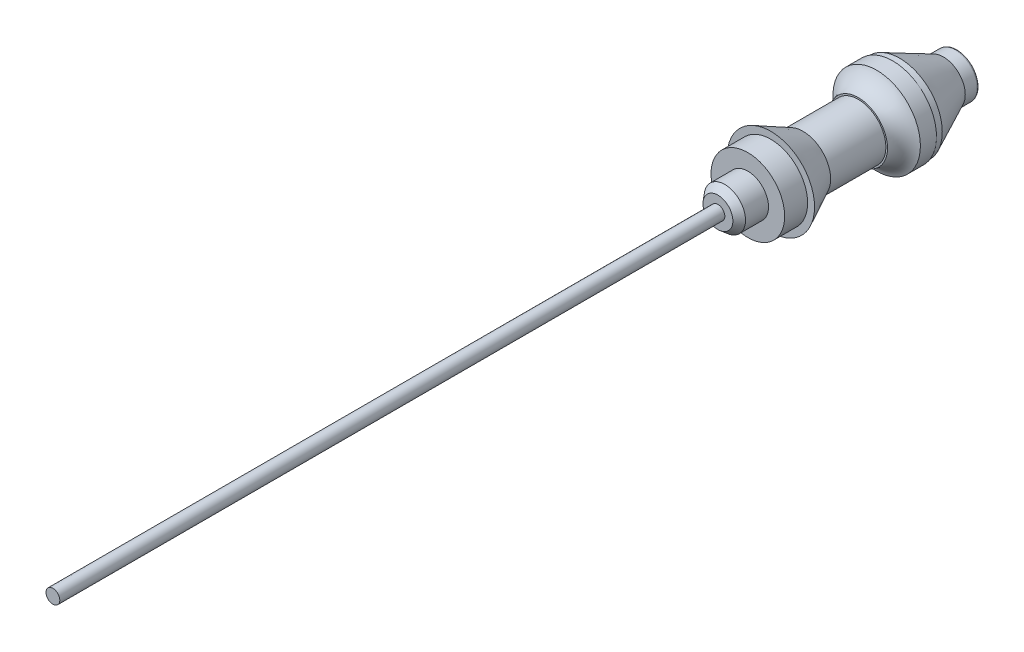
ISO-10303-21;
HEADER;
FILE_DESCRIPTION(('STEP AP214'),'2;1');
FILE_NAME('part.step','',(''),(''),'','','');
FILE_SCHEMA(('AUTOMOTIVE_DESIGN { 1 0 10303 214 1 1 1 1 }'));
ENDSEC;
DATA;
#1=APPLICATION_CONTEXT('core data for automotive mechanical design processes');
#2=APPLICATION_PROTOCOL_DEFINITION('international standard','automotive_design',2000,#1);
#3=PRODUCT_CONTEXT('',#1,'mechanical');
#4=PRODUCT('Part','Part','',(#3));
#5=PRODUCT_RELATED_PRODUCT_CATEGORY('part','',(#4));
#6=PRODUCT_DEFINITION_FORMATION('','',#4);
#7=PRODUCT_DEFINITION_CONTEXT('part definition',#1,'design');
#8=PRODUCT_DEFINITION('design','',#6,#7);
#9=PRODUCT_DEFINITION_SHAPE('','',#8);
#10=(LENGTH_UNIT() NAMED_UNIT(*) SI_UNIT(.MILLI.,.METRE.));
#11=(NAMED_UNIT(*) PLANE_ANGLE_UNIT() SI_UNIT($,.RADIAN.));
#12=(NAMED_UNIT(*) SI_UNIT($,.STERADIAN.) SOLID_ANGLE_UNIT());
#13=UNCERTAINTY_MEASURE_WITH_UNIT(LENGTH_MEASURE(1.E-05),#10,'distance_accuracy_value','');
#14=(GEOMETRIC_REPRESENTATION_CONTEXT(3) GLOBAL_UNCERTAINTY_ASSIGNED_CONTEXT((#13)) GLOBAL_UNIT_ASSIGNED_CONTEXT((#10,
#11,#12)) REPRESENTATION_CONTEXT('',''));
#15=CARTESIAN_POINT('',(0.,0.,0.));
#16=DIRECTION('',(0.,0.,1.));
#17=DIRECTION('',(1.,0.,0.));
#18=AXIS2_PLACEMENT_3D('',#15,#16,#17);
#19=CARTESIAN_POINT('',(0.,8.7,-393.));
#20=DIRECTION('',(0.,0.,1.));
#21=DIRECTION('',(1.,0.,0.));
#22=AXIS2_PLACEMENT_3D('',#19,#20,#21);
#23=PLANE('',#22);
#24=CARTESIAN_POINT('',(0.,0.,-393.));
#25=DIRECTION('',(0.,0.,1.));
#26=DIRECTION('',(1.,0.,0.));
#27=AXIS2_PLACEMENT_3D('',#24,#25,#26);
#28=CIRCLE('',#27,8.7);
#29=CARTESIAN_POINT('',(8.7,0.,-393.));
#30=VERTEX_POINT('',#29);
#31=EDGE_CURVE('E10',#30,#30,#28,.T.);
#32=ORIENTED_EDGE('',*,*,#31,.F.);
#33=EDGE_LOOP('',(#32));
#34=FACE_BOUND('',#33,.T.);
#35=ADVANCED_FACE('F33',(#34),#23,.F.);
#36=CARTESIAN_POINT('',(0.,0.,-392.2));
#37=DIRECTION('',(0.,0.,1.));
#38=DIRECTION('',(1.,0.,0.));
#39=AXIS2_PLACEMENT_3D('',#36,#37,#38);
#40=TOROIDAL_SURFACE('',#39,8.7,0.800000000000011);
#41=CARTESIAN_POINT('',(0.,0.,-392.2));
#42=DIRECTION('',(0.,0.,1.));
#43=DIRECTION('',(1.,0.,0.));
#44=AXIS2_PLACEMENT_3D('',#41,#42,#43);
#45=CIRCLE('',#44,9.5);
#46=CARTESIAN_POINT('',(9.5,0.,-392.2));
#47=VERTEX_POINT('',#46);
#48=EDGE_CURVE('E39',#47,#47,#45,.T.);
#49=ORIENTED_EDGE('',*,*,#48,.F.);
#50=EDGE_LOOP('',(#49));
#51=FACE_BOUND('',#50,.T.);
#52=ORIENTED_EDGE('',*,*,#31,.T.);
#53=EDGE_LOOP('',(#52));
#54=FACE_BOUND('',#53,.T.);
#55=ADVANCED_FACE('F189',(#51,#54),#40,.T.);
#56=CARTESIAN_POINT('',(0.,0.,0.));
#57=DIRECTION('',(0.,0.,1.));
#58=DIRECTION('',(1.,0.,0.));
#59=AXIS2_PLACEMENT_3D('',#56,#57,#58);
#60=CYLINDRICAL_SURFACE('',#59,9.5);
#61=CARTESIAN_POINT('',(0.,0.,-387.));
#62=DIRECTION('',(0.,0.,1.));
#63=DIRECTION('',(1.,0.,0.));
#64=AXIS2_PLACEMENT_3D('',#61,#62,#63);
#65=CIRCLE('',#64,9.5);
#66=CARTESIAN_POINT('',(9.5,0.,-387.));
#67=VERTEX_POINT('',#66);
#68=EDGE_CURVE('E43',#67,#67,#65,.T.);
#69=ORIENTED_EDGE('',*,*,#68,.F.);
#70=EDGE_LOOP('',(#69));
#71=FACE_BOUND('',#70,.T.);
#72=ORIENTED_EDGE('',*,*,#48,.T.);
#73=EDGE_LOOP('',(#72));
#74=FACE_BOUND('',#73,.T.);
#75=ADVANCED_FACE('F184',(#71,#74),#60,.T.);
#76=CARTESIAN_POINT('',(0.,0.,-387.));
#77=DIRECTION('',(0.,0.,1.));
#78=DIRECTION('',(1.,0.,0.));
#79=AXIS2_PLACEMENT_3D('',#76,#77,#78);
#80=CONICAL_SURFACE('',#79,9.5,0.442374222976745);
#81=CARTESIAN_POINT('',(0.,0.,-368.));
#82=DIRECTION('',(0.,0.,1.));
#83=DIRECTION('',(1.,0.,0.));
#84=AXIS2_PLACEMENT_3D('',#81,#82,#83);
#85=CIRCLE('',#84,18.5);
#86=CARTESIAN_POINT('',(18.5,0.,-368.));
#87=VERTEX_POINT('',#86);
#88=EDGE_CURVE('E47',#87,#87,#85,.T.);
#89=ORIENTED_EDGE('',*,*,#88,.F.);
#90=EDGE_LOOP('',(#89));
#91=FACE_BOUND('',#90,.T.);
#92=ORIENTED_EDGE('',*,*,#68,.T.);
#93=EDGE_LOOP('',(#92));
#94=FACE_BOUND('',#93,.T.);
#95=ADVANCED_FACE('F178',(#91,#94),#80,.T.);
#96=CARTESIAN_POINT('',(0.,0.,0.));
#97=DIRECTION('',(0.,0.,1.));
#98=DIRECTION('',(1.,0.,0.));
#99=AXIS2_PLACEMENT_3D('',#96,#97,#98);
#100=CYLINDRICAL_SURFACE('',#99,18.5);
#101=CARTESIAN_POINT('',(0.,0.,-365.));
#102=DIRECTION('',(0.,0.,1.));
#103=DIRECTION('',(1.,0.,0.));
#104=AXIS2_PLACEMENT_3D('',#101,#102,#103);
#105=CIRCLE('',#104,18.5);
#106=CARTESIAN_POINT('',(18.5,0.,-365.));
#107=VERTEX_POINT('',#106);
#108=EDGE_CURVE('E52',#107,#107,#105,.T.);
#109=ORIENTED_EDGE('',*,*,#108,.F.);
#110=EDGE_LOOP('',(#109));
#111=FACE_BOUND('',#110,.T.);
#112=ORIENTED_EDGE('',*,*,#88,.T.);
#113=EDGE_LOOP('',(#112));
#114=FACE_BOUND('',#113,.T.);
#115=ADVANCED_FACE('F172',(#111,#114),#100,.T.);
#116=CARTESIAN_POINT('',(0.,19.,-365.));
#117=DIRECTION('',(0.,0.,1.));
#118=DIRECTION('',(1.,0.,0.));
#119=AXIS2_PLACEMENT_3D('',#116,#117,#118);
#120=PLANE('',#119);
#121=CARTESIAN_POINT('',(0.,0.,-365.));
#122=DIRECTION('',(0.,0.,1.));
#123=DIRECTION('',(1.,0.,0.));
#124=AXIS2_PLACEMENT_3D('',#121,#122,#123);
#125=CIRCLE('',#124,19.);
#126=CARTESIAN_POINT('',(19.,0.,-365.));
#127=VERTEX_POINT('',#126);
#128=EDGE_CURVE('E55',#127,#127,#125,.T.);
#129=ORIENTED_EDGE('',*,*,#128,.F.);
#130=EDGE_LOOP('',(#129));
#131=FACE_BOUND('',#130,.T.);
#132=ORIENTED_EDGE('',*,*,#108,.T.);
#133=EDGE_LOOP('',(#132));
#134=FACE_BOUND('',#133,.T.);
#135=ADVANCED_FACE('F166',(#131,#134),#120,.F.);
#136=CARTESIAN_POINT('',(0.,0.,0.));
#137=DIRECTION('',(0.,0.,1.));
#138=DIRECTION('',(1.,0.,0.));
#139=AXIS2_PLACEMENT_3D('',#136,#137,#138);
#140=CYLINDRICAL_SURFACE('',#139,19.);
#141=CARTESIAN_POINT('',(0.,0.,-357.999073931162));
#142=DIRECTION('',(0.,0.,1.));
#143=DIRECTION('',(1.,0.,0.));
#144=AXIS2_PLACEMENT_3D('',#141,#142,#143);
#145=CIRCLE('',#144,19.);
#146=CARTESIAN_POINT('',(19.,0.,-357.999073931162));
#147=VERTEX_POINT('',#146);
#148=EDGE_CURVE('E58',#147,#147,#145,.T.);
#149=ORIENTED_EDGE('',*,*,#148,.F.);
#150=EDGE_LOOP('',(#149));
#151=FACE_BOUND('',#150,.T.);
#152=ORIENTED_EDGE('',*,*,#128,.T.);
#153=EDGE_LOOP('',(#152));
#154=FACE_BOUND('',#153,.T.);
#155=ADVANCED_FACE('F160',(#151,#154),#140,.T.);
#156=CARTESIAN_POINT('',(0.,0.,-348.674127160922));
#157=DIRECTION('',(0.,0.,1.));
#158=DIRECTION('',(1.,0.,0.));
#159=AXIS2_PLACEMENT_3D('',#156,#157,#158);
#160=TOROIDAL_SURFACE('',#159,22.6118371685591,10.);
#161=CARTESIAN_POINT('',(0.,0.,-349.999073931162));
#162=DIRECTION('',(0.,0.,1.));
#163=DIRECTION('',(1.,0.,0.));
#164=AXIS2_PLACEMENT_3D('',#161,#162,#163);
#165=CIRCLE('',#164,12.7);
#166=CARTESIAN_POINT('',(12.7,0.,-349.999073931162));
#167=VERTEX_POINT('',#166);
#168=EDGE_CURVE('E61',#167,#167,#165,.T.);
#169=ORIENTED_EDGE('',*,*,#168,.F.);
#170=EDGE_LOOP('',(#169));
#171=FACE_BOUND('',#170,.T.);
#172=ORIENTED_EDGE('',*,*,#148,.T.);
#173=EDGE_LOOP('',(#172));
#174=FACE_BOUND('',#173,.T.);
#175=ADVANCED_FACE('F154',(#171,#174),#160,.F.);
#176=CARTESIAN_POINT('',(0.,12.,-349.999073931162));
#177=DIRECTION('',(0.,0.,-1.));
#178=DIRECTION('',(-1.,0.,0.));
#179=AXIS2_PLACEMENT_3D('',#176,#177,#178);
#180=PLANE('',#179);
#181=CARTESIAN_POINT('',(0.,0.,-349.999073931162));
#182=DIRECTION('',(0.,0.,1.));
#183=DIRECTION('',(1.,0.,0.));
#184=AXIS2_PLACEMENT_3D('',#181,#182,#183);
#185=CIRCLE('',#184,12.);
#186=CARTESIAN_POINT('',(12.,0.,-349.999073931162));
#187=VERTEX_POINT('',#186);
#188=EDGE_CURVE('E64',#187,#187,#185,.T.);
#189=ORIENTED_EDGE('',*,*,#188,.F.);
#190=EDGE_LOOP('',(#189));
#191=FACE_BOUND('',#190,.T.);
#192=ORIENTED_EDGE('',*,*,#168,.T.);
#193=EDGE_LOOP('',(#192));
#194=FACE_BOUND('',#193,.T.);
#195=ADVANCED_FACE('F148',(#191,#194),#180,.F.);
#196=CARTESIAN_POINT('',(0.,0.,0.));
#197=DIRECTION('',(0.,0.,1.));
#198=DIRECTION('',(1.,0.,0.));
#199=AXIS2_PLACEMENT_3D('',#196,#197,#198);
#200=CYLINDRICAL_SURFACE('',#199,12.);
#201=CARTESIAN_POINT('',(0.,0.,-325.999073931162));
#202=DIRECTION('',(0.,0.,1.));
#203=DIRECTION('',(1.,0.,0.));
#204=AXIS2_PLACEMENT_3D('',#201,#202,#203);
#205=CIRCLE('',#204,12.);
#206=CARTESIAN_POINT('',(12.,0.,-325.999073931162));
#207=VERTEX_POINT('',#206);
#208=EDGE_CURVE('E67',#207,#207,#205,.T.);
#209=ORIENTED_EDGE('',*,*,#208,.F.);
#210=EDGE_LOOP('',(#209));
#211=FACE_BOUND('',#210,.T.);
#212=ORIENTED_EDGE('',*,*,#188,.T.);
#213=EDGE_LOOP('',(#212));
#214=FACE_BOUND('',#213,.T.);
#215=ADVANCED_FACE('F142',(#211,#214),#200,.T.);
#216=CARTESIAN_POINT('',(0.,0.,-325.999073931162));
#217=DIRECTION('',(0.,0.,1.));
#218=DIRECTION('',(1.,0.,0.));
#219=AXIS2_PLACEMENT_3D('',#216,#217,#218);
#220=CONICAL_SURFACE('',#219,12.,0.463647609000806);
#221=CARTESIAN_POINT('',(0.,0.,-311.999073931162));
#222=DIRECTION('',(0.,0.,1.));
#223=DIRECTION('',(1.,0.,0.));
#224=AXIS2_PLACEMENT_3D('',#221,#222,#223);
#225=CIRCLE('',#224,19.);
#226=CARTESIAN_POINT('',(19.,0.,-311.999073931162));
#227=VERTEX_POINT('',#226);
#228=EDGE_CURVE('E70',#227,#227,#225,.T.);
#229=ORIENTED_EDGE('',*,*,#228,.F.);
#230=EDGE_LOOP('',(#229));
#231=FACE_BOUND('',#230,.T.);
#232=ORIENTED_EDGE('',*,*,#208,.T.);
#233=EDGE_LOOP('',(#232));
#234=FACE_BOUND('',#233,.T.);
#235=ADVANCED_FACE('F136',(#231,#234),#220,.T.);
#236=CARTESIAN_POINT('',(0.,16.,-311.999073931162));
#237=DIRECTION('',(0.,0.,-1.));
#238=DIRECTION('',(-1.,0.,0.));
#239=AXIS2_PLACEMENT_3D('',#236,#237,#238);
#240=PLANE('',#239);
#241=CARTESIAN_POINT('',(0.,0.,-311.999073931162));
#242=DIRECTION('',(0.,0.,1.));
#243=DIRECTION('',(1.,0.,0.));
#244=AXIS2_PLACEMENT_3D('',#241,#242,#243);
#245=CIRCLE('',#244,16.);
#246=CARTESIAN_POINT('',(16.,0.,-311.999073931162));
#247=VERTEX_POINT('',#246);
#248=EDGE_CURVE('E73',#247,#247,#245,.T.);
#249=ORIENTED_EDGE('',*,*,#248,.F.);
#250=EDGE_LOOP('',(#249));
#251=FACE_BOUND('',#250,.T.);
#252=ORIENTED_EDGE('',*,*,#228,.T.);
#253=EDGE_LOOP('',(#252));
#254=FACE_BOUND('',#253,.T.);
#255=ADVANCED_FACE('F130',(#251,#254),#240,.F.);
#256=CARTESIAN_POINT('',(0.,0.,0.));
#257=DIRECTION('',(0.,0.,1.));
#258=DIRECTION('',(1.,0.,0.));
#259=AXIS2_PLACEMENT_3D('',#256,#257,#258);
#260=CYLINDRICAL_SURFACE('',#259,16.);
#261=CARTESIAN_POINT('',(0.,0.,-301.999073931162));
#262=DIRECTION('',(0.,0.,1.));
#263=DIRECTION('',(1.,0.,0.));
#264=AXIS2_PLACEMENT_3D('',#261,#262,#263);
#265=CIRCLE('',#264,16.);
#266=CARTESIAN_POINT('',(16.,0.,-301.999073931162));
#267=VERTEX_POINT('',#266);
#268=EDGE_CURVE('E76',#267,#267,#265,.T.);
#269=ORIENTED_EDGE('',*,*,#268,.F.);
#270=EDGE_LOOP('',(#269));
#271=FACE_BOUND('',#270,.T.);
#272=ORIENTED_EDGE('',*,*,#248,.T.);
#273=EDGE_LOOP('',(#272));
#274=FACE_BOUND('',#273,.T.);
#275=ADVANCED_FACE('F124',(#271,#274),#260,.T.);
#276=CARTESIAN_POINT('',(0.,9.,-301.999073931162));
#277=DIRECTION('',(0.,0.,-1.));
#278=DIRECTION('',(-1.,0.,0.));
#279=AXIS2_PLACEMENT_3D('',#276,#277,#278);
#280=PLANE('',#279);
#281=CARTESIAN_POINT('',(0.,0.,-301.999073931162));
#282=DIRECTION('',(0.,0.,1.));
#283=DIRECTION('',(1.,0.,0.));
#284=AXIS2_PLACEMENT_3D('',#281,#282,#283);
#285=CIRCLE('',#284,9.);
#286=CARTESIAN_POINT('',(9.,0.,-301.999073931162));
#287=VERTEX_POINT('',#286);
#288=EDGE_CURVE('E79',#287,#287,#285,.T.);
#289=ORIENTED_EDGE('',*,*,#288,.F.);
#290=EDGE_LOOP('',(#289));
#291=FACE_BOUND('',#290,.T.);
#292=ORIENTED_EDGE('',*,*,#268,.T.);
#293=EDGE_LOOP('',(#292));
#294=FACE_BOUND('',#293,.T.);
#295=ADVANCED_FACE('F118',(#291,#294),#280,.F.);
#296=CARTESIAN_POINT('',(0.,0.,0.));
#297=DIRECTION('',(0.,0.,1.));
#298=DIRECTION('',(1.,0.,0.));
#299=AXIS2_PLACEMENT_3D('',#296,#297,#298);
#300=CYLINDRICAL_SURFACE('',#299,9.);
#301=CARTESIAN_POINT('',(0.,0.,-291.999073931162));
#302=DIRECTION('',(0.,0.,1.));
#303=DIRECTION('',(1.,0.,0.));
#304=AXIS2_PLACEMENT_3D('',#301,#302,#303);
#305=CIRCLE('',#304,9.);
#306=CARTESIAN_POINT('',(9.,0.,-291.999073931162));
#307=VERTEX_POINT('',#306);
#308=EDGE_CURVE('E82',#307,#307,#305,.T.);
#309=ORIENTED_EDGE('',*,*,#308,.F.);
#310=EDGE_LOOP('',(#309));
#311=FACE_BOUND('',#310,.T.);
#312=ORIENTED_EDGE('',*,*,#288,.T.);
#313=EDGE_LOOP('',(#312));
#314=FACE_BOUND('',#313,.T.);
#315=ADVANCED_FACE('F112',(#311,#314),#300,.T.);
#316=CARTESIAN_POINT('',(0.,0.,-291.999073931162));
#317=DIRECTION('',(0.,0.,-1.));
#318=DIRECTION('',(-1.,0.,0.));
#319=AXIS2_PLACEMENT_3D('',#316,#317,#318);
#320=CONICAL_SURFACE('',#319,9.,0.69489011842134);
#321=CARTESIAN_POINT('',(0.,0.,-289.));
#322=DIRECTION('',(0.,0.,1.));
#323=DIRECTION('',(1.,0.,0.));
#324=AXIS2_PLACEMENT_3D('',#321,#322,#323);
#325=CIRCLE('',#324,6.5);
#326=CARTESIAN_POINT('',(6.5,0.,-289.));
#327=VERTEX_POINT('',#326);
#328=EDGE_CURVE('E85',#327,#327,#325,.T.);
#329=ORIENTED_EDGE('',*,*,#328,.F.);
#330=EDGE_LOOP('',(#329));
#331=FACE_BOUND('',#330,.T.);
#332=ORIENTED_EDGE('',*,*,#308,.T.);
#333=EDGE_LOOP('',(#332));
#334=FACE_BOUND('',#333,.T.);
#335=ADVANCED_FACE('F106',(#331,#334),#320,.T.);
#336=CARTESIAN_POINT('',(0.,3.,-289.));
#337=DIRECTION('',(0.,0.,-1.));
#338=DIRECTION('',(-1.,0.,0.));
#339=AXIS2_PLACEMENT_3D('',#336,#337,#338);
#340=PLANE('',#339);
#341=CARTESIAN_POINT('',(0.,0.,-289.));
#342=DIRECTION('',(0.,0.,1.));
#343=DIRECTION('',(1.,0.,0.));
#344=AXIS2_PLACEMENT_3D('',#341,#342,#343);
#345=CIRCLE('',#344,3.);
#346=CARTESIAN_POINT('',(3.,0.,-289.));
#347=VERTEX_POINT('',#346);
#348=EDGE_CURVE('E88',#347,#347,#345,.T.);
#349=ORIENTED_EDGE('',*,*,#348,.F.);
#350=EDGE_LOOP('',(#349));
#351=FACE_BOUND('',#350,.T.);
#352=ORIENTED_EDGE('',*,*,#328,.T.);
#353=EDGE_LOOP('',(#352));
#354=FACE_BOUND('',#353,.T.);
#355=ADVANCED_FACE('F100',(#351,#354),#340,.F.);
#356=CARTESIAN_POINT('',(0.,0.,0.));
#357=DIRECTION('',(0.,0.,1.));
#358=DIRECTION('',(1.,0.,0.));
#359=AXIS2_PLACEMENT_3D('',#356,#357,#358);
#360=CYLINDRICAL_SURFACE('',#359,3.);
#361=CARTESIAN_POINT('',(0.,0.,0.));
#362=DIRECTION('',(0.,0.,1.));
#363=DIRECTION('',(1.,0.,0.));
#364=AXIS2_PLACEMENT_3D('',#361,#362,#363);
#365=CIRCLE('',#364,3.);
#366=CARTESIAN_POINT('',(3.,0.,0.));
#367=VERTEX_POINT('',#366);
#368=EDGE_CURVE('E91',#367,#367,#365,.T.);
#369=ORIENTED_EDGE('',*,*,#368,.F.);
#370=EDGE_LOOP('',(#369));
#371=FACE_BOUND('',#370,.T.);
#372=ORIENTED_EDGE('',*,*,#348,.T.);
#373=EDGE_LOOP('',(#372));
#374=FACE_BOUND('',#373,.T.);
#375=ADVANCED_FACE('F97',(#371,#374),#360,.T.);
#376=CARTESIAN_POINT('',(0.,0.,0.));
#377=DIRECTION('',(0.,0.,-1.));
#378=DIRECTION('',(-1.,0.,0.));
#379=AXIS2_PLACEMENT_3D('',#376,#377,#378);
#380=PLANE('',#379);
#381=ORIENTED_EDGE('',*,*,#368,.T.);
#382=EDGE_LOOP('',(#381));
#383=FACE_BOUND('',#382,.T.);
#384=ADVANCED_FACE('F95',(#383),#380,.F.);
#385=CLOSED_SHELL('',(#35,#55,#75,#95,#115,#135,#155,#175,#195,#215,#235,#255,#275,#295,#315,
#335,#355,#375,#384));
#386=MANIFOLD_SOLID_BREP('B2',#385);
#387=ADVANCED_BREP_SHAPE_REPRESENTATION('',(#18,#386),#14);
#388=SHAPE_DEFINITION_REPRESENTATION(#9,#387);
ENDSEC;
END-ISO-10303-21;
